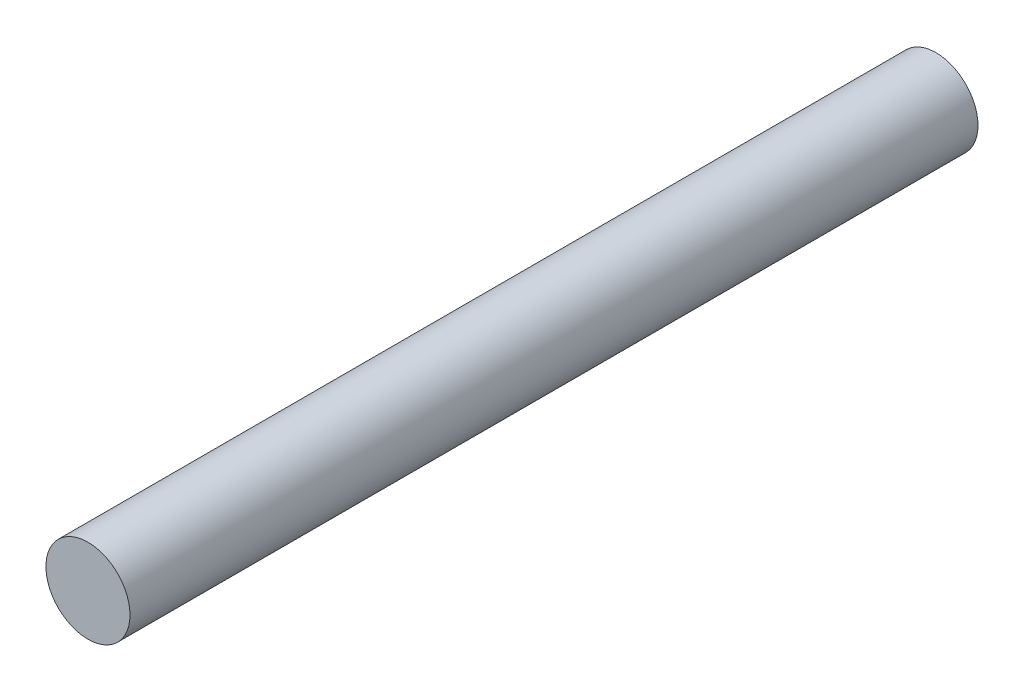
ISO-10303-21;
HEADER;
FILE_DESCRIPTION(('STEP AP214'),'2;1');
FILE_NAME('part.step','',(''),(''),'','','');
FILE_SCHEMA(('AUTOMOTIVE_DESIGN { 1 0 10303 214 1 1 1 1 }'));
ENDSEC;
DATA;
#1=APPLICATION_CONTEXT('core data for automotive mechanical design processes');
#2=APPLICATION_PROTOCOL_DEFINITION('international standard','automotive_design',2000,#1);
#3=PRODUCT_CONTEXT('',#1,'mechanical');
#4=PRODUCT('Part','Part','',(#3));
#5=PRODUCT_RELATED_PRODUCT_CATEGORY('part','',(#4));
#6=PRODUCT_DEFINITION_FORMATION('','',#4);
#7=PRODUCT_DEFINITION_CONTEXT('part definition',#1,'design');
#8=PRODUCT_DEFINITION('design','',#6,#7);
#9=PRODUCT_DEFINITION_SHAPE('','',#8);
#10=(LENGTH_UNIT() NAMED_UNIT(*) SI_UNIT(.MILLI.,.METRE.));
#11=(NAMED_UNIT(*) PLANE_ANGLE_UNIT() SI_UNIT($,.RADIAN.));
#12=(NAMED_UNIT(*) SI_UNIT($,.STERADIAN.) SOLID_ANGLE_UNIT());
#13=UNCERTAINTY_MEASURE_WITH_UNIT(LENGTH_MEASURE(1.E-05),#10,'distance_accuracy_value','');
#14=(GEOMETRIC_REPRESENTATION_CONTEXT(3) GLOBAL_UNCERTAINTY_ASSIGNED_CONTEXT((#13)) GLOBAL_UNIT_ASSIGNED_CONTEXT((#10,
#11,#12)) REPRESENTATION_CONTEXT('',''));
#15=CARTESIAN_POINT('',(0.,0.,0.));
#16=DIRECTION('',(0.,0.,1.));
#17=DIRECTION('',(1.,0.,0.));
#18=AXIS2_PLACEMENT_3D('',#15,#16,#17);
#19=CARTESIAN_POINT('',(0.,0.,64.049999916));
#20=DIRECTION('',(0.,0.,-1.));
#21=DIRECTION('',(-1.,0.,0.));
#22=AXIS2_PLACEMENT_3D('',#19,#20,#21);
#23=CYLINDRICAL_SURFACE('',#22,3.175);
#24=CARTESIAN_POINT('',(0.,0.,64.049999916));
#25=DIRECTION('',(0.,0.,1.));
#26=DIRECTION('',(1.,0.,0.));
#27=AXIS2_PLACEMENT_3D('',#24,#25,#26);
#28=CIRCLE('',#27,3.175);
#29=CARTESIAN_POINT('',(3.175,0.,64.049999916));
#30=VERTEX_POINT('',#29);
#31=EDGE_CURVE('E9',#30,#30,#28,.T.);
#32=ORIENTED_EDGE('',*,*,#31,.F.);
#33=EDGE_LOOP('',(#32));
#34=FACE_BOUND('',#33,.T.);
#35=CARTESIAN_POINT('',(0.,0.,0.));
#36=DIRECTION('',(0.,0.,1.));
#37=DIRECTION('',(1.,0.,0.));
#38=AXIS2_PLACEMENT_3D('',#35,#36,#37);
#39=CIRCLE('',#38,3.175);
#40=CARTESIAN_POINT('',(3.175,0.,0.));
#41=VERTEX_POINT('',#40);
#42=EDGE_CURVE('E17',#41,#41,#39,.T.);
#43=ORIENTED_EDGE('',*,*,#42,.T.);
#44=EDGE_LOOP('',(#43));
#45=FACE_BOUND('',#44,.T.);
#46=ADVANCED_FACE('F14',(#34,#45),#23,.T.);
#47=CARTESIAN_POINT('',(0.,0.,64.049999916));
#48=DIRECTION('',(0.,0.,1.));
#49=DIRECTION('',(1.,0.,0.));
#50=AXIS2_PLACEMENT_3D('',#47,#48,#49);
#51=PLANE('',#50);
#52=ORIENTED_EDGE('',*,*,#31,.T.);
#53=EDGE_LOOP('',(#52));
#54=FACE_BOUND('',#53,.T.);
#55=ADVANCED_FACE('F38',(#54),#51,.T.);
#56=CARTESIAN_POINT('',(0.,0.,0.));
#57=DIRECTION('',(0.,0.,1.));
#58=DIRECTION('',(1.,0.,0.));
#59=AXIS2_PLACEMENT_3D('',#56,#57,#58);
#60=PLANE('',#59);
#61=ORIENTED_EDGE('',*,*,#42,.F.);
#62=EDGE_LOOP('',(#61));
#63=FACE_BOUND('',#62,.T.);
#64=ADVANCED_FACE('F36',(#63),#60,.F.);
#65=CLOSED_SHELL('',(#46,#55,#64));
#66=MANIFOLD_SOLID_BREP('B1',#65);
#67=ADVANCED_BREP_SHAPE_REPRESENTATION('',(#18,#66),#14);
#68=SHAPE_DEFINITION_REPRESENTATION(#9,#67);
ENDSEC;
END-ISO-10303-21;
